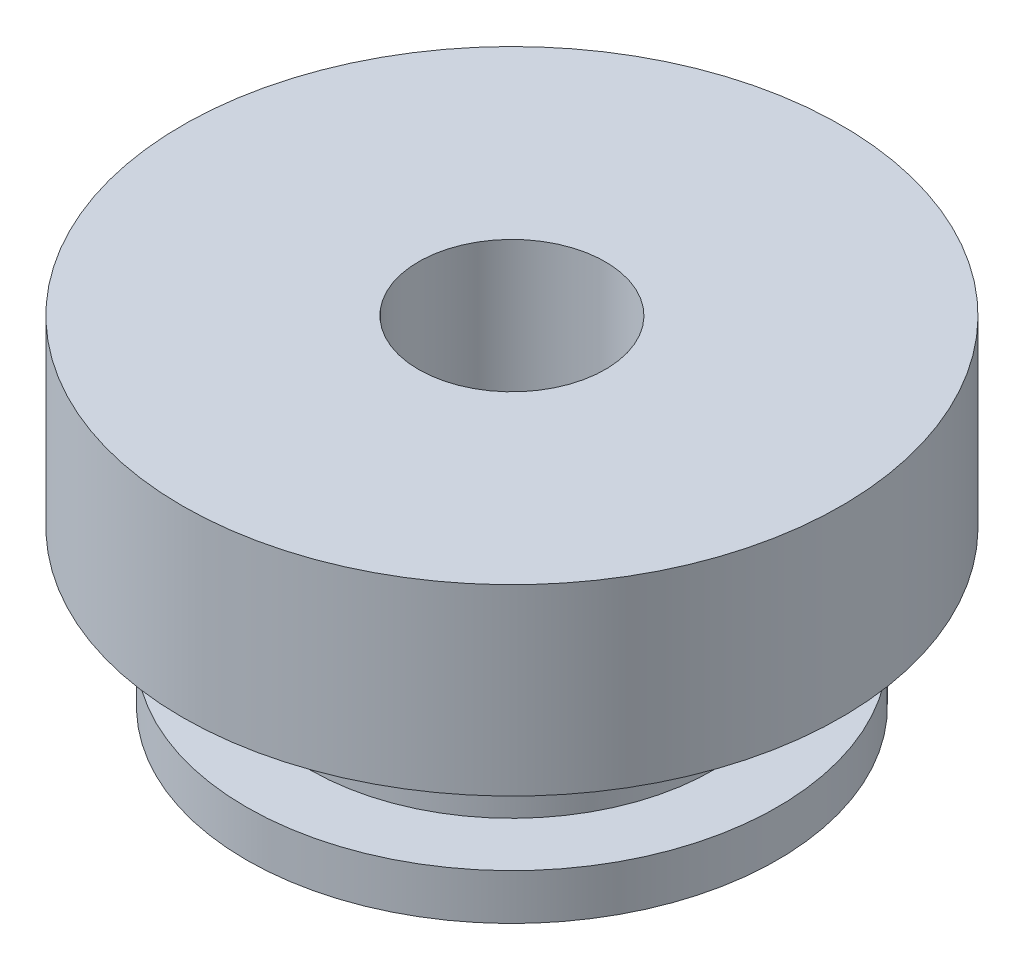
ISO-10303-21;
HEADER;
FILE_DESCRIPTION(('STEP AP214'),'2;1');
FILE_NAME('part.step','',(''),(''),'','','');
FILE_SCHEMA(('AUTOMOTIVE_DESIGN { 1 0 10303 214 1 1 1 1 }'));
ENDSEC;
DATA;
#1=APPLICATION_CONTEXT('core data for automotive mechanical design processes');
#2=APPLICATION_PROTOCOL_DEFINITION('international standard','automotive_design',2000,#1);
#3=PRODUCT_CONTEXT('',#1,'mechanical');
#4=PRODUCT('Part','Part','',(#3));
#5=PRODUCT_RELATED_PRODUCT_CATEGORY('part','',(#4));
#6=PRODUCT_DEFINITION_FORMATION('','',#4);
#7=PRODUCT_DEFINITION_CONTEXT('part definition',#1,'design');
#8=PRODUCT_DEFINITION('design','',#6,#7);
#9=PRODUCT_DEFINITION_SHAPE('','',#8);
#10=(LENGTH_UNIT() NAMED_UNIT(*) SI_UNIT(.MILLI.,.METRE.));
#11=(NAMED_UNIT(*) PLANE_ANGLE_UNIT() SI_UNIT($,.RADIAN.));
#12=(NAMED_UNIT(*) SI_UNIT($,.STERADIAN.) SOLID_ANGLE_UNIT());
#13=UNCERTAINTY_MEASURE_WITH_UNIT(LENGTH_MEASURE(1.E-05),#10,'distance_accuracy_value','');
#14=(GEOMETRIC_REPRESENTATION_CONTEXT(3) GLOBAL_UNCERTAINTY_ASSIGNED_CONTEXT((#13)) GLOBAL_UNIT_ASSIGNED_CONTEXT((#10,
#11,#12)) REPRESENTATION_CONTEXT('',''));
#15=CARTESIAN_POINT('',(0.,0.,0.));
#16=DIRECTION('',(0.,0.,1.));
#17=DIRECTION('',(1.,0.,0.));
#18=AXIS2_PLACEMENT_3D('',#15,#16,#17);
#19=CARTESIAN_POINT('',(0.,1.25,0.));
#20=DIRECTION('',(0.,1.,0.));
#21=DIRECTION('',(0.,0.,1.));
#22=AXIS2_PLACEMENT_3D('',#19,#20,#21);
#23=PLANE('',#22);
#24=CARTESIAN_POINT('',(0.,1.25,0.));
#25=DIRECTION('',(0.,1.,0.));
#26=DIRECTION('',(0.,0.,1.));
#27=AXIS2_PLACEMENT_3D('',#24,#25,#26);
#28=CIRCLE('',#27,7.25);
#29=CARTESIAN_POINT('',(0.,1.25,7.25));
#30=VERTEX_POINT('',#29);
#31=EDGE_CURVE('E10',#30,#30,#28,.T.);
#32=ORIENTED_EDGE('',*,*,#31,.T.);
#33=EDGE_LOOP('',(#32));
#34=FACE_BOUND('',#33,.T.);
#35=CARTESIAN_POINT('',(0.,1.25,0.));
#36=DIRECTION('',(0.,1.,0.));
#37=DIRECTION('',(0.,0.,1.));
#38=AXIS2_PLACEMENT_3D('',#35,#36,#37);
#39=CIRCLE('',#38,5.5);
#40=CARTESIAN_POINT('',(0.,1.25,5.5));
#41=VERTEX_POINT('',#40);
#42=EDGE_CURVE('E44',#41,#41,#39,.T.);
#43=ORIENTED_EDGE('',*,*,#42,.F.);
#44=EDGE_LOOP('',(#43));
#45=FACE_BOUND('',#44,.T.);
#46=ADVANCED_FACE('F31',(#34,#45),#23,.T.);
#47=CARTESIAN_POINT('',(0.,1.25,0.));
#48=DIRECTION('',(0.,-1.,0.));
#49=DIRECTION('',(0.,0.,-1.));
#50=AXIS2_PLACEMENT_3D('',#47,#48,#49);
#51=CYLINDRICAL_SURFACE('',#50,7.25);
#52=ORIENTED_EDGE('',*,*,#31,.F.);
#53=EDGE_LOOP('',(#52));
#54=FACE_BOUND('',#53,.T.);
#55=CARTESIAN_POINT('',(0.,0.,0.));
#56=DIRECTION('',(0.,1.,0.));
#57=DIRECTION('',(0.,0.,1.));
#58=AXIS2_PLACEMENT_3D('',#55,#56,#57);
#59=CIRCLE('',#58,7.25);
#60=CARTESIAN_POINT('',(0.,0.,7.25));
#61=VERTEX_POINT('',#60);
#62=EDGE_CURVE('E35',#61,#61,#59,.T.);
#63=ORIENTED_EDGE('',*,*,#62,.T.);
#64=EDGE_LOOP('',(#63));
#65=FACE_BOUND('',#64,.T.);
#66=ADVANCED_FACE('F33',(#54,#65),#51,.T.);
#67=CARTESIAN_POINT('',(0.,0.,0.));
#68=DIRECTION('',(0.,1.,0.));
#69=DIRECTION('',(0.,0.,1.));
#70=AXIS2_PLACEMENT_3D('',#67,#68,#69);
#71=PLANE('',#70);
#72=ORIENTED_EDGE('',*,*,#62,.F.);
#73=EDGE_LOOP('',(#72));
#74=FACE_BOUND('',#73,.T.);
#75=ADVANCED_FACE('F85',(#74),#71,.F.);
#76=CARTESIAN_POINT('',(0.,4.25,0.));
#77=DIRECTION('',(0.,-1.,0.));
#78=DIRECTION('',(0.,0.,-1.));
#79=AXIS2_PLACEMENT_3D('',#76,#77,#78);
#80=CYLINDRICAL_SURFACE('',#79,5.5);
#81=CARTESIAN_POINT('',(0.,4.25,0.));
#82=DIRECTION('',(0.,1.,0.));
#83=DIRECTION('',(0.,0.,1.));
#84=AXIS2_PLACEMENT_3D('',#81,#82,#83);
#85=CIRCLE('',#84,5.5);
#86=CARTESIAN_POINT('',(0.,4.25,5.5));
#87=VERTEX_POINT('',#86);
#88=EDGE_CURVE('E42',#87,#87,#85,.T.);
#89=ORIENTED_EDGE('',*,*,#88,.F.);
#90=EDGE_LOOP('',(#89));
#91=FACE_BOUND('',#90,.T.);
#92=ORIENTED_EDGE('',*,*,#42,.T.);
#93=EDGE_LOOP('',(#92));
#94=FACE_BOUND('',#93,.T.);
#95=ADVANCED_FACE('F79',(#91,#94),#80,.T.);
#96=CARTESIAN_POINT('',(0.,4.25,0.));
#97=DIRECTION('',(0.,1.,0.));
#98=DIRECTION('',(0.,0.,1.));
#99=AXIS2_PLACEMENT_3D('',#96,#97,#98);
#100=PLANE('',#99);
#101=CARTESIAN_POINT('',(0.,4.25,0.));
#102=DIRECTION('',(0.,1.,0.));
#103=DIRECTION('',(0.,0.,1.));
#104=AXIS2_PLACEMENT_3D('',#101,#102,#103);
#105=CIRCLE('',#104,9.);
#106=CARTESIAN_POINT('',(0.,4.25,9.));
#107=VERTEX_POINT('',#106);
#108=EDGE_CURVE('E50',#107,#107,#105,.T.);
#109=ORIENTED_EDGE('',*,*,#108,.F.);
#110=EDGE_LOOP('',(#109));
#111=FACE_BOUND('',#110,.T.);
#112=ORIENTED_EDGE('',*,*,#88,.T.);
#113=EDGE_LOOP('',(#112));
#114=FACE_BOUND('',#113,.T.);
#115=ADVANCED_FACE('F73',(#111,#114),#100,.F.);
#116=CARTESIAN_POINT('',(0.,9.25,0.));
#117=DIRECTION('',(0.,-1.,0.));
#118=DIRECTION('',(0.,0.,-1.));
#119=AXIS2_PLACEMENT_3D('',#116,#117,#118);
#120=CYLINDRICAL_SURFACE('',#119,9.);
#121=CARTESIAN_POINT('',(0.,9.25,0.));
#122=DIRECTION('',(0.,1.,0.));
#123=DIRECTION('',(0.,0.,1.));
#124=AXIS2_PLACEMENT_3D('',#121,#122,#123);
#125=CIRCLE('',#124,9.);
#126=CARTESIAN_POINT('',(0.,9.25,9.));
#127=VERTEX_POINT('',#126);
#128=EDGE_CURVE('E47',#127,#127,#125,.T.);
#129=ORIENTED_EDGE('',*,*,#128,.F.);
#130=EDGE_LOOP('',(#129));
#131=FACE_BOUND('',#130,.T.);
#132=ORIENTED_EDGE('',*,*,#108,.T.);
#133=EDGE_LOOP('',(#132));
#134=FACE_BOUND('',#133,.T.);
#135=ADVANCED_FACE('F67',(#131,#134),#120,.T.);
#136=CARTESIAN_POINT('',(0.,9.25,0.));
#137=DIRECTION('',(0.,1.,0.));
#138=DIRECTION('',(0.,0.,1.));
#139=AXIS2_PLACEMENT_3D('',#136,#137,#138);
#140=PLANE('',#139);
#141=CARTESIAN_POINT('',(0.,9.25,0.));
#142=DIRECTION('',(0.,1.,0.));
#143=DIRECTION('',(0.,0.,1.));
#144=AXIS2_PLACEMENT_3D('',#141,#142,#143);
#145=CIRCLE('',#144,2.55);
#146=CARTESIAN_POINT('',(0.,9.25,2.55));
#147=VERTEX_POINT('',#146);
#148=EDGE_CURVE('E58',#147,#147,#145,.T.);
#149=ORIENTED_EDGE('',*,*,#148,.F.);
#150=EDGE_LOOP('',(#149));
#151=FACE_BOUND('',#150,.T.);
#152=ORIENTED_EDGE('',*,*,#128,.T.);
#153=EDGE_LOOP('',(#152));
#154=FACE_BOUND('',#153,.T.);
#155=ADVANCED_FACE('F64',(#151,#154),#140,.T.);
#156=CARTESIAN_POINT('',(0.,-5.96248916810278,0.));
#157=DIRECTION('',(0.,1.,0.));
#158=DIRECTION('',(0.,0.,1.));
#159=AXIS2_PLACEMENT_3D('',#156,#157,#158);
#160=CYLINDRICAL_SURFACE('',#159,2.55);
#161=CARTESIAN_POINT('',(0.,1.25,0.));
#162=DIRECTION('',(0.,1.,0.));
#163=DIRECTION('',(0.,0.,1.));
#164=AXIS2_PLACEMENT_3D('',#161,#162,#163);
#165=CIRCLE('',#164,2.55);
#166=CARTESIAN_POINT('',(0.,1.25,2.55));
#167=VERTEX_POINT('',#166);
#168=EDGE_CURVE('E53',#167,#167,#165,.F.);
#169=CARTESIAN_POINT('',(0.,1.25,2.55));
#170=CARTESIAN_POINT('',(0.,1.33333333333333,2.55));
#171=CARTESIAN_POINT('',(0.,1.41666666666667,2.55));
#172=CARTESIAN_POINT('',(0.,1.58333333333333,2.55));
#173=CARTESIAN_POINT('',(0.,1.66666666666667,2.55));
#174=CARTESIAN_POINT('',(0.,1.83333333333333,2.55));
#175=CARTESIAN_POINT('',(0.,1.91666666666667,2.55));
#176=CARTESIAN_POINT('',(0.,2.08333333333333,2.55));
#177=CARTESIAN_POINT('',(0.,2.16666666666667,2.55));
#178=CARTESIAN_POINT('',(0.,2.33333333333333,2.55));
#179=CARTESIAN_POINT('',(0.,2.41666666666667,2.55));
#180=CARTESIAN_POINT('',(0.,2.58333333333333,2.55));
#181=CARTESIAN_POINT('',(0.,2.66666666666667,2.55));
#182=CARTESIAN_POINT('',(0.,2.83333333333333,2.55));
#183=CARTESIAN_POINT('',(0.,2.91666666666667,2.55));
#184=CARTESIAN_POINT('',(0.,3.08333333333333,2.55));
#185=CARTESIAN_POINT('',(0.,3.16666666666667,2.55));
#186=CARTESIAN_POINT('',(0.,3.33333333333333,2.55));
#187=CARTESIAN_POINT('',(0.,3.41666666666667,2.55));
#188=CARTESIAN_POINT('',(0.,3.58333333333333,2.55));
#189=CARTESIAN_POINT('',(0.,3.66666666666667,2.55));
#190=CARTESIAN_POINT('',(0.,3.83333333333333,2.55));
#191=CARTESIAN_POINT('',(0.,3.91666666666667,2.55));
#192=CARTESIAN_POINT('',(0.,4.08333333333333,2.55));
#193=CARTESIAN_POINT('',(0.,4.16666666666667,2.55));
#194=CARTESIAN_POINT('',(0.,4.33333333333333,2.55));
#195=CARTESIAN_POINT('',(0.,4.41666666666667,2.55));
#196=CARTESIAN_POINT('',(0.,4.58333333333333,2.55));
#197=CARTESIAN_POINT('',(0.,4.66666666666667,2.55));
#198=CARTESIAN_POINT('',(0.,4.83333333333333,2.55));
#199=CARTESIAN_POINT('',(0.,4.91666666666667,2.55));
#200=CARTESIAN_POINT('',(0.,5.08333333333333,2.55));
#201=CARTESIAN_POINT('',(0.,5.16666666666667,2.55));
#202=CARTESIAN_POINT('',(0.,5.33333333333333,2.55));
#203=CARTESIAN_POINT('',(0.,5.41666666666667,2.55));
#204=CARTESIAN_POINT('',(0.,5.58333333333333,2.55));
#205=CARTESIAN_POINT('',(0.,5.66666666666667,2.55));
#206=CARTESIAN_POINT('',(0.,5.83333333333333,2.55));
#207=CARTESIAN_POINT('',(0.,5.91666666666667,2.55));
#208=CARTESIAN_POINT('',(0.,6.08333333333333,2.55));
#209=CARTESIAN_POINT('',(0.,6.16666666666667,2.55));
#210=CARTESIAN_POINT('',(0.,6.33333333333333,2.55));
#211=CARTESIAN_POINT('',(0.,6.41666666666667,2.55));
#212=CARTESIAN_POINT('',(0.,6.58333333333333,2.55));
#213=CARTESIAN_POINT('',(0.,6.66666666666667,2.55));
#214=CARTESIAN_POINT('',(0.,6.83333333333333,2.55));
#215=CARTESIAN_POINT('',(0.,6.91666666666667,2.55));
#216=CARTESIAN_POINT('',(0.,7.08333333333333,2.55));
#217=CARTESIAN_POINT('',(0.,7.16666666666667,2.55));
#218=CARTESIAN_POINT('',(0.,7.33333333333333,2.55));
#219=CARTESIAN_POINT('',(0.,7.41666666666667,2.55));
#220=CARTESIAN_POINT('',(0.,7.58333333333333,2.55));
#221=CARTESIAN_POINT('',(0.,7.66666666666667,2.55));
#222=CARTESIAN_POINT('',(0.,7.83333333333333,2.55));
#223=CARTESIAN_POINT('',(0.,7.91666666666667,2.55));
#224=CARTESIAN_POINT('',(0.,8.08333333333333,2.55));
#225=CARTESIAN_POINT('',(0.,8.16666666666667,2.55));
#226=CARTESIAN_POINT('',(0.,8.33333333333333,2.55));
#227=CARTESIAN_POINT('',(0.,8.41666666666667,2.55));
#228=CARTESIAN_POINT('',(0.,8.58333333333333,2.55));
#229=CARTESIAN_POINT('',(0.,8.66666666666667,2.55));
#230=CARTESIAN_POINT('',(0.,8.83333333333333,2.55));
#231=CARTESIAN_POINT('',(0.,8.91666666666667,2.55));
#232=CARTESIAN_POINT('',(0.,9.08333333333333,2.55));
#233=CARTESIAN_POINT('',(0.,9.16666666666667,2.55));
#234=CARTESIAN_POINT('',(0.,9.25,2.55));
#235=B_SPLINE_CURVE_WITH_KNOTS('',3,(#169,#170,#171,#172,#173,#174,#175,#176,#177,#178,#179,
#180,#181,#182,#183,#184,#185,#186,#187,#188,#189,#190,#191,#192,#193,#194,#195,#196,#197,#198,
#199,#200,#201,#202,#203,#204,#205,#206,#207,#208,#209,#210,#211,#212,#213,#214,#215,#216,#217,
#218,#219,#220,#221,#222,#223,#224,#225,#226,#227,#228,#229,#230,#231,#232,#233,#234),
.UNSPECIFIED.,.F.,.F.,(4,2,2,2,2,2,2,2,2,2,2,2,2,2,2,2,2,2,2,2,2,2,2,2,2,2,2,2,2,2,2,2,4),(0.,
0.25,0.5,0.75,1.,1.25,1.5,1.75,2.,2.25,2.5,2.75,3.,3.25,3.5,3.75,4.,4.25,4.5,4.75,5.,5.25,5.5,
5.75,6.,6.25,6.5,6.75,7.,7.25,7.5,7.75,8.),.UNSPECIFIED.);
#236=EDGE_CURVE('BSEAM62',#167,#147,#235,.T.);
#237=ORIENTED_EDGE('',*,*,#168,.T.);
#238=ORIENTED_EDGE('',*,*,#148,.T.);
#239=ORIENTED_EDGE('',*,*,#236,.T.);
#240=ORIENTED_EDGE('',*,*,#236,.F.);
#241=EDGE_LOOP('',(#237,#239,#238,#240));
#242=FACE_BOUND('',#241,.T.);
#243=ADVANCED_FACE('F62',(#242),#160,.F.);
#244=CARTESIAN_POINT('',(0.,1.25,0.));
#245=DIRECTION('',(0.,1.,0.));
#246=DIRECTION('',(0.,0.,1.));
#247=AXIS2_PLACEMENT_3D('',#244,#245,#246);
#248=PLANE('',#247);
#249=ORIENTED_EDGE('',*,*,#168,.F.);
#250=EDGE_LOOP('',(#249));
#251=FACE_BOUND('',#250,.T.);
#252=ADVANCED_FACE('F125',(#251),#248,.T.);
#253=CLOSED_SHELL('',(#46,#66,#75,#95,#115,#135,#155,#243,#252));
#254=MANIFOLD_SOLID_BREP('B2',#253);
#255=ADVANCED_BREP_SHAPE_REPRESENTATION('',(#18,#254),#14);
#256=SHAPE_DEFINITION_REPRESENTATION(#9,#255);
ENDSEC;
END-ISO-10303-21;
